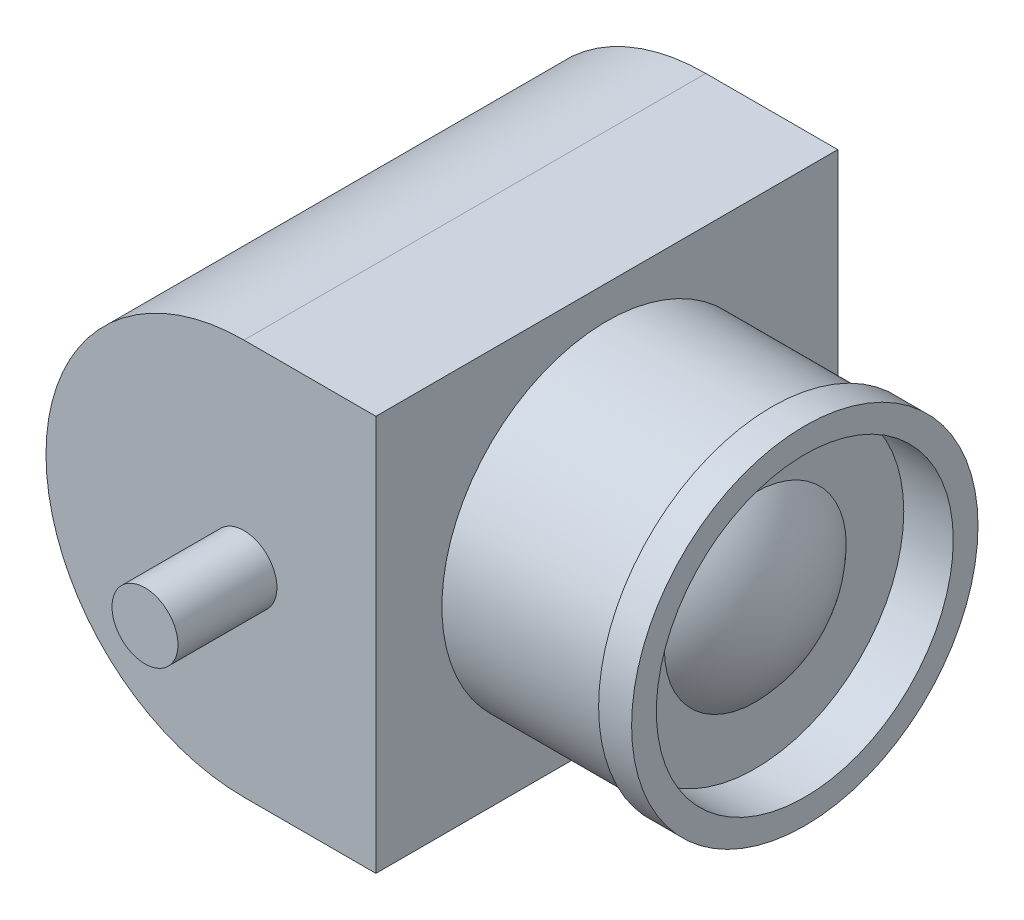
ISO-10303-21;
HEADER;
FILE_DESCRIPTION(('STEP AP214'),'2;1');
FILE_NAME('part.step','',(''),(''),'','','');
FILE_SCHEMA(('AUTOMOTIVE_DESIGN { 1 0 10303 214 1 1 1 1 }'));
ENDSEC;
DATA;
#1=APPLICATION_CONTEXT('core data for automotive mechanical design processes');
#2=APPLICATION_PROTOCOL_DEFINITION('international standard','automotive_design',2000,#1);
#3=PRODUCT_CONTEXT('',#1,'mechanical');
#4=PRODUCT('Part','Part','',(#3));
#5=PRODUCT_RELATED_PRODUCT_CATEGORY('part','',(#4));
#6=PRODUCT_DEFINITION_FORMATION('','',#4);
#7=PRODUCT_DEFINITION_CONTEXT('part definition',#1,'design');
#8=PRODUCT_DEFINITION('design','',#6,#7);
#9=PRODUCT_DEFINITION_SHAPE('','',#8);
#10=(LENGTH_UNIT() NAMED_UNIT(*) SI_UNIT(.MILLI.,.METRE.));
#11=(NAMED_UNIT(*) PLANE_ANGLE_UNIT() SI_UNIT($,.RADIAN.));
#12=(NAMED_UNIT(*) SI_UNIT($,.STERADIAN.) SOLID_ANGLE_UNIT());
#13=UNCERTAINTY_MEASURE_WITH_UNIT(LENGTH_MEASURE(1.E-05),#10,'distance_accuracy_value','');
#14=(GEOMETRIC_REPRESENTATION_CONTEXT(3) GLOBAL_UNCERTAINTY_ASSIGNED_CONTEXT((#13)) GLOBAL_UNIT_ASSIGNED_CONTEXT((#10,
#11,#12)) REPRESENTATION_CONTEXT('',''));
#15=CARTESIAN_POINT('',(0.,0.,0.));
#16=DIRECTION('',(0.,0.,1.));
#17=DIRECTION('',(1.,0.,0.));
#18=AXIS2_PLACEMENT_3D('',#15,#16,#17);
#19=CARTESIAN_POINT('',(10.,6.,-7.));
#20=DIRECTION('',(0.,0.,1.));
#21=DIRECTION('',(0.,-1.,0.));
#22=AXIS2_PLACEMENT_3D('',#19,#20,#21);
#23=PLANE('',#22);
#24=CARTESIAN_POINT('',(6.,0.,-7.));
#25=DIRECTION('',(0.,0.,1.));
#26=DIRECTION('',(0.,-1.,0.));
#27=AXIS2_PLACEMENT_3D('',#24,#25,#26);
#28=CIRCLE('',#27,1.);
#29=CARTESIAN_POINT('',(6.,-1.,-7.));
#30=VERTEX_POINT('',#29);
#31=EDGE_CURVE('E11',#30,#30,#28,.F.);
#32=ORIENTED_EDGE('',*,*,#31,.F.);
#33=EDGE_LOOP('',(#32));
#34=FACE_BOUND('',#33,.T.);
#35=DIRECTION('',(-1.,0.,0.));
#36=VECTOR('',#35,1.);
#37=CARTESIAN_POINT('',(10.,-6.,-7.));
#38=LINE('',#37,#36);
#39=CARTESIAN_POINT('',(10.,-6.,-7.));
#40=VERTEX_POINT('',#39);
#41=CARTESIAN_POINT('',(6.,-6.,-7.));
#42=VERTEX_POINT('',#41);
#43=EDGE_CURVE('E162',#40,#42,#38,.T.);
#44=ORIENTED_EDGE('',*,*,#43,.T.);
#45=CARTESIAN_POINT('',(6.,0.,-7.));
#46=DIRECTION('',(0.,0.,1.));
#47=DIRECTION('',(0.,-1.,0.));
#48=AXIS2_PLACEMENT_3D('',#45,#46,#47);
#49=CIRCLE('',#48,6.);
#50=CARTESIAN_POINT('',(0.,0.,-7.));
#51=VERTEX_POINT('',#50);
#52=EDGE_CURVE('E133',#42,#51,#49,.F.);
#53=ORIENTED_EDGE('',*,*,#52,.T.);
#54=CARTESIAN_POINT('',(6.,0.,-7.));
#55=DIRECTION('',(0.,0.,1.));
#56=DIRECTION('',(0.,-1.,0.));
#57=AXIS2_PLACEMENT_3D('',#54,#55,#56);
#58=CIRCLE('',#57,6.);
#59=CARTESIAN_POINT('',(6.,6.,-7.));
#60=VERTEX_POINT('',#59);
#61=EDGE_CURVE('E114',#51,#60,#58,.F.);
#62=ORIENTED_EDGE('',*,*,#61,.T.);
#63=DIRECTION('',(-1.,0.,0.));
#64=VECTOR('',#63,1.);
#65=CARTESIAN_POINT('',(10.,6.,-7.));
#66=LINE('',#65,#64);
#67=CARTESIAN_POINT('',(10.,6.,-7.));
#68=VERTEX_POINT('',#67);
#69=EDGE_CURVE('E96',#68,#60,#66,.T.);
#70=ORIENTED_EDGE('',*,*,#69,.F.);
#71=DIRECTION('',(0.,1.,0.));
#72=VECTOR('',#71,1.);
#73=CARTESIAN_POINT('',(10.,6.,-7.));
#74=LINE('',#73,#72);
#75=EDGE_CURVE('E101',#40,#68,#74,.T.);
#76=ORIENTED_EDGE('',*,*,#75,.F.);
#77=EDGE_LOOP('',(#44,#53,#62,#70,#76));
#78=FACE_BOUND('',#77,.T.);
#79=ADVANCED_FACE('F44',(#34,#78),#23,.F.);
#80=CARTESIAN_POINT('',(10.,6.,7.));
#81=DIRECTION('',(0.,-1.,0.));
#82=DIRECTION('',(0.,0.,-1.));
#83=AXIS2_PLACEMENT_3D('',#80,#81,#82);
#84=PLANE('',#83);
#85=ORIENTED_EDGE('',*,*,#69,.T.);
#86=DIRECTION('',(0.,0.,1.));
#87=VECTOR('',#86,1.);
#88=CARTESIAN_POINT('',(6.,6.,7.));
#89=LINE('',#88,#87);
#90=CARTESIAN_POINT('',(6.,6.,7.));
#91=VERTEX_POINT('',#90);
#92=EDGE_CURVE('E63',#60,#91,#89,.T.);
#93=ORIENTED_EDGE('',*,*,#92,.T.);
#94=DIRECTION('',(-1.,0.,0.));
#95=VECTOR('',#94,1.);
#96=CARTESIAN_POINT('',(10.,6.,7.));
#97=LINE('',#96,#95);
#98=CARTESIAN_POINT('',(10.,6.,7.));
#99=VERTEX_POINT('',#98);
#100=EDGE_CURVE('E100',#99,#91,#97,.T.);
#101=ORIENTED_EDGE('',*,*,#100,.F.);
#102=DIRECTION('',(0.,0.,1.));
#103=VECTOR('',#102,1.);
#104=CARTESIAN_POINT('',(10.,6.,7.));
#105=LINE('',#104,#103);
#106=EDGE_CURVE('E95',#68,#99,#105,.T.);
#107=ORIENTED_EDGE('',*,*,#106,.F.);
#108=EDGE_LOOP('',(#85,#93,#101,#107));
#109=FACE_BOUND('',#108,.T.);
#110=ADVANCED_FACE('F94',(#109),#84,.F.);
#111=CARTESIAN_POINT('',(10.,6.,7.));
#112=DIRECTION('',(0.,0.,-1.));
#113=DIRECTION('',(0.,1.,0.));
#114=AXIS2_PLACEMENT_3D('',#111,#112,#113);
#115=PLANE('',#114);
#116=CARTESIAN_POINT('',(6.,0.,7.));
#117=DIRECTION('',(0.,0.,-1.));
#118=DIRECTION('',(0.,1.,0.));
#119=AXIS2_PLACEMENT_3D('',#116,#117,#118);
#120=CIRCLE('',#119,1.);
#121=CARTESIAN_POINT('',(6.,0.999999999999998,7.));
#122=VERTEX_POINT('',#121);
#123=EDGE_CURVE('E47',#122,#122,#120,.F.);
#124=ORIENTED_EDGE('',*,*,#123,.F.);
#125=EDGE_LOOP('',(#124));
#126=FACE_BOUND('',#125,.T.);
#127=CARTESIAN_POINT('',(6.,0.,7.));
#128=DIRECTION('',(0.,0.,-1.));
#129=DIRECTION('',(0.,1.,0.));
#130=AXIS2_PLACEMENT_3D('',#127,#128,#129);
#131=CIRCLE('',#130,6.);
#132=CARTESIAN_POINT('',(0.,0.,7.));
#133=VERTEX_POINT('',#132);
#134=EDGE_CURVE('E68',#91,#133,#131,.F.);
#135=ORIENTED_EDGE('',*,*,#134,.T.);
#136=CARTESIAN_POINT('',(6.,0.,7.));
#137=DIRECTION('',(0.,0.,-1.));
#138=DIRECTION('',(0.,1.,0.));
#139=AXIS2_PLACEMENT_3D('',#136,#137,#138);
#140=CIRCLE('',#139,6.);
#141=CARTESIAN_POINT('',(6.,-6.,7.));
#142=VERTEX_POINT('',#141);
#143=EDGE_CURVE('E134',#133,#142,#140,.F.);
#144=ORIENTED_EDGE('',*,*,#143,.T.);
#145=DIRECTION('',(-1.,0.,0.));
#146=VECTOR('',#145,1.);
#147=CARTESIAN_POINT('',(10.,-6.,7.));
#148=LINE('',#147,#146);
#149=CARTESIAN_POINT('',(10.,-6.,7.));
#150=VERTEX_POINT('',#149);
#151=EDGE_CURVE('E119',#150,#142,#148,.T.);
#152=ORIENTED_EDGE('',*,*,#151,.F.);
#153=DIRECTION('',(0.,-1.,0.));
#154=VECTOR('',#153,1.);
#155=CARTESIAN_POINT('',(10.,6.,7.));
#156=LINE('',#155,#154);
#157=EDGE_CURVE('E99',#99,#150,#156,.T.);
#158=ORIENTED_EDGE('',*,*,#157,.F.);
#159=ORIENTED_EDGE('',*,*,#100,.T.);
#160=EDGE_LOOP('',(#135,#144,#152,#158,#159));
#161=FACE_BOUND('',#160,.T.);
#162=ADVANCED_FACE('F189',(#126,#161),#115,.F.);
#163=CARTESIAN_POINT('',(10.,-6.,7.));
#164=DIRECTION('',(0.,1.,0.));
#165=DIRECTION('',(0.,0.,1.));
#166=AXIS2_PLACEMENT_3D('',#163,#164,#165);
#167=PLANE('',#166);
#168=ORIENTED_EDGE('',*,*,#151,.T.);
#169=DIRECTION('',(0.,0.,-1.));
#170=VECTOR('',#169,1.);
#171=CARTESIAN_POINT('',(6.,-6.,7.));
#172=LINE('',#171,#170);
#173=EDGE_CURVE('E120',#142,#42,#172,.T.);
#174=ORIENTED_EDGE('',*,*,#173,.T.);
#175=ORIENTED_EDGE('',*,*,#43,.F.);
#176=DIRECTION('',(0.,0.,-1.));
#177=VECTOR('',#176,1.);
#178=CARTESIAN_POINT('',(10.,-6.,7.));
#179=LINE('',#178,#177);
#180=EDGE_CURVE('E106',#150,#40,#179,.T.);
#181=ORIENTED_EDGE('',*,*,#180,.F.);
#182=EDGE_LOOP('',(#168,#174,#175,#181));
#183=FACE_BOUND('',#182,.T.);
#184=ADVANCED_FACE('F169',(#183),#167,.F.);
#185=CARTESIAN_POINT('',(10.,0.,0.));
#186=DIRECTION('',(1.,0.,0.));
#187=DIRECTION('',(0.,0.,-1.));
#188=AXIS2_PLACEMENT_3D('',#185,#186,#187);
#189=PLANE('',#188);
#190=CARTESIAN_POINT('',(10.,0.,0.));
#191=DIRECTION('',(1.,0.,0.));
#192=DIRECTION('',(0.,0.,-1.));
#193=AXIS2_PLACEMENT_3D('',#190,#191,#192);
#194=CIRCLE('',#193,5.);
#195=CARTESIAN_POINT('',(10.,0.,-5.));
#196=VERTEX_POINT('',#195);
#197=EDGE_CURVE('E111',#196,#196,#194,.T.);
#198=ORIENTED_EDGE('',*,*,#197,.F.);
#199=EDGE_LOOP('',(#198));
#200=FACE_BOUND('',#199,.T.);
#201=ORIENTED_EDGE('',*,*,#75,.T.);
#202=ORIENTED_EDGE('',*,*,#106,.T.);
#203=ORIENTED_EDGE('',*,*,#157,.T.);
#204=ORIENTED_EDGE('',*,*,#180,.T.);
#205=EDGE_LOOP('',(#201,#202,#203,#204));
#206=FACE_BOUND('',#205,.T.);
#207=ADVANCED_FACE('F102',(#200,#206),#189,.T.);
#208=CARTESIAN_POINT('',(15.,0.,0.));
#209=DIRECTION('',(-1.,0.,0.));
#210=DIRECTION('',(0.,0.,1.));
#211=AXIS2_PLACEMENT_3D('',#208,#209,#210);
#212=CYLINDRICAL_SURFACE('',#211,5.);
#213=CARTESIAN_POINT('',(15.,0.,0.));
#214=DIRECTION('',(1.,0.,0.));
#215=DIRECTION('',(0.,0.,-1.));
#216=AXIS2_PLACEMENT_3D('',#213,#214,#215);
#217=CIRCLE('',#216,5.);
#218=CARTESIAN_POINT('',(15.,0.,-5.));
#219=VERTEX_POINT('',#218);
#220=EDGE_CURVE('E109',#219,#219,#217,.T.);
#221=ORIENTED_EDGE('',*,*,#220,.F.);
#222=EDGE_LOOP('',(#221));
#223=FACE_BOUND('',#222,.T.);
#224=ORIENTED_EDGE('',*,*,#197,.T.);
#225=EDGE_LOOP('',(#224));
#226=FACE_BOUND('',#225,.T.);
#227=ADVANCED_FACE('F196',(#223,#226),#212,.T.);
#228=CARTESIAN_POINT('',(16.,0.,0.));
#229=DIRECTION('',(-1.,0.,0.));
#230=DIRECTION('',(0.,0.,1.));
#231=AXIS2_PLACEMENT_3D('',#228,#229,#230);
#232=CYLINDRICAL_SURFACE('',#231,5.25);
#233=CARTESIAN_POINT('',(16.,0.,0.));
#234=DIRECTION('',(1.,0.,0.));
#235=DIRECTION('',(0.,0.,-1.));
#236=AXIS2_PLACEMENT_3D('',#233,#234,#235);
#237=CIRCLE('',#236,5.25);
#238=CARTESIAN_POINT('',(16.,0.,-5.25));
#239=VERTEX_POINT('',#238);
#240=EDGE_CURVE('E152',#239,#239,#237,.T.);
#241=ORIENTED_EDGE('',*,*,#240,.F.);
#242=EDGE_LOOP('',(#241));
#243=FACE_BOUND('',#242,.T.);
#244=CARTESIAN_POINT('',(15.,0.,0.));
#245=DIRECTION('',(1.,0.,0.));
#246=DIRECTION('',(0.,0.,-1.));
#247=AXIS2_PLACEMENT_3D('',#244,#245,#246);
#248=CIRCLE('',#247,5.25);
#249=CARTESIAN_POINT('',(15.,0.,-5.25));
#250=VERTEX_POINT('',#249);
#251=EDGE_CURVE('E151',#250,#250,#248,.T.);
#252=ORIENTED_EDGE('',*,*,#251,.T.);
#253=EDGE_LOOP('',(#252));
#254=FACE_BOUND('',#253,.T.);
#255=ADVANCED_FACE('F205',(#243,#254),#232,.T.);
#256=CARTESIAN_POINT('',(16.,0.,0.));
#257=DIRECTION('',(1.,0.,0.));
#258=DIRECTION('',(0.,0.,-1.));
#259=AXIS2_PLACEMENT_3D('',#256,#257,#258);
#260=PLANE('',#259);
#261=CARTESIAN_POINT('',(16.,0.,0.));
#262=DIRECTION('',(1.,0.,0.));
#263=DIRECTION('',(0.,0.,-1.));
#264=AXIS2_PLACEMENT_3D('',#261,#262,#263);
#265=CIRCLE('',#264,4.5);
#266=CARTESIAN_POINT('',(16.,0.,-4.5));
#267=VERTEX_POINT('',#266);
#268=EDGE_CURVE('E127',#267,#267,#265,.T.);
#269=ORIENTED_EDGE('',*,*,#268,.F.);
#270=EDGE_LOOP('',(#269));
#271=FACE_BOUND('',#270,.T.);
#272=ORIENTED_EDGE('',*,*,#240,.T.);
#273=EDGE_LOOP('',(#272));
#274=FACE_BOUND('',#273,.T.);
#275=ADVANCED_FACE('F206',(#271,#274),#260,.T.);
#276=CARTESIAN_POINT('',(15.,0.,0.));
#277=DIRECTION('',(1.,0.,0.));
#278=DIRECTION('',(0.,0.,-1.));
#279=AXIS2_PLACEMENT_3D('',#276,#277,#278);
#280=PLANE('',#279);
#281=ORIENTED_EDGE('',*,*,#220,.T.);
#282=EDGE_LOOP('',(#281));
#283=FACE_BOUND('',#282,.T.);
#284=ORIENTED_EDGE('',*,*,#251,.F.);
#285=EDGE_LOOP('',(#284));
#286=FACE_BOUND('',#285,.T.);
#287=ADVANCED_FACE('F208',(#283,#286),#280,.F.);
#288=CARTESIAN_POINT('',(14.5,0.,0.));
#289=DIRECTION('',(1.,0.,0.));
#290=DIRECTION('',(0.,0.,-1.));
#291=AXIS2_PLACEMENT_3D('',#288,#289,#290);
#292=CYLINDRICAL_SURFACE('',#291,4.5);
#293=CARTESIAN_POINT('',(14.5,0.,0.));
#294=DIRECTION('',(1.,0.,0.));
#295=DIRECTION('',(0.,0.,-1.));
#296=AXIS2_PLACEMENT_3D('',#293,#294,#295);
#297=CIRCLE('',#296,4.5);
#298=CARTESIAN_POINT('',(14.5,0.,-4.5));
#299=VERTEX_POINT('',#298);
#300=EDGE_CURVE('E146',#299,#299,#297,.T.);
#301=ORIENTED_EDGE('',*,*,#300,.F.);
#302=EDGE_LOOP('',(#301));
#303=FACE_BOUND('',#302,.T.);
#304=ORIENTED_EDGE('',*,*,#268,.T.);
#305=EDGE_LOOP('',(#304));
#306=FACE_BOUND('',#305,.T.);
#307=ADVANCED_FACE('F211',(#303,#306),#292,.F.);
#308=CARTESIAN_POINT('',(14.5,0.,0.));
#309=DIRECTION('',(1.,0.,0.));
#310=DIRECTION('',(0.,0.,-1.));
#311=AXIS2_PLACEMENT_3D('',#308,#309,#310);
#312=PLANE('',#311);
#313=CARTESIAN_POINT('',(14.5,0.,0.));
#314=DIRECTION('',(1.,0.,0.));
#315=DIRECTION('',(0.,0.,-1.));
#316=AXIS2_PLACEMENT_3D('',#313,#314,#315);
#317=CIRCLE('',#316,2.75499546279118);
#318=CARTESIAN_POINT('',(14.5,0.,-2.75499546279118));
#319=VERTEX_POINT('',#318);
#320=EDGE_CURVE('E123',#319,#319,#317,.F.);
#321=ORIENTED_EDGE('',*,*,#320,.T.);
#322=EDGE_LOOP('',(#321));
#323=FACE_BOUND('',#322,.T.);
#324=ORIENTED_EDGE('',*,*,#300,.T.);
#325=EDGE_LOOP('',(#324));
#326=FACE_BOUND('',#325,.T.);
#327=ADVANCED_FACE('F179',(#323,#326),#312,.T.);
#328=CARTESIAN_POINT('',(11.6,0.,0.));
#329=DIRECTION('',(-1.,0.,0.));
#330=DIRECTION('',(0.,0.,1.));
#331=AXIS2_PLACEMENT_3D('',#328,#329,#330);
#332=SPHERICAL_SURFACE('',#331,4.);
#333=ORIENTED_EDGE('',*,*,#320,.F.);
#334=EDGE_LOOP('',(#333));
#335=FACE_BOUND('',#334,.T.);
#336=ADVANCED_FACE('F175',(#335),#332,.T.);
#337=CARTESIAN_POINT('',(6.,0.,7.));
#338=DIRECTION('',(0.,0.,1.));
#339=DIRECTION('',(1.,0.,0.));
#340=AXIS2_PLACEMENT_3D('',#337,#338,#339);
#341=CYLINDRICAL_SURFACE('',#340,6.);
#342=DIRECTION('',(0.,0.,1.));
#343=VECTOR('',#342,1.);
#344=CARTESIAN_POINT('',(0.,0.,0.));
#345=LINE('',#344,#343);
#346=EDGE_CURVE('E130',#133,#51,#345,.F.);
#347=ORIENTED_EDGE('',*,*,#346,.F.);
#348=ORIENTED_EDGE('',*,*,#134,.F.);
#349=ORIENTED_EDGE('',*,*,#92,.F.);
#350=ORIENTED_EDGE('',*,*,#61,.F.);
#351=EDGE_LOOP('',(#347,#348,#349,#350));
#352=FACE_BOUND('',#351,.T.);
#353=ADVANCED_FACE('F50',(#352),#341,.T.);
#354=CARTESIAN_POINT('',(6.,0.,7.));
#355=DIRECTION('',(0.,0.,-1.));
#356=DIRECTION('',(-1.,0.,0.));
#357=AXIS2_PLACEMENT_3D('',#354,#355,#356);
#358=CYLINDRICAL_SURFACE('',#357,6.);
#359=ORIENTED_EDGE('',*,*,#143,.F.);
#360=ORIENTED_EDGE('',*,*,#346,.T.);
#361=ORIENTED_EDGE('',*,*,#52,.F.);
#362=ORIENTED_EDGE('',*,*,#173,.F.);
#363=EDGE_LOOP('',(#359,#360,#361,#362));
#364=FACE_BOUND('',#363,.T.);
#365=ADVANCED_FACE('F166',(#364),#358,.T.);
#366=CARTESIAN_POINT('',(6.,0.,10.));
#367=DIRECTION('',(0.,0.,1.));
#368=DIRECTION('',(1.,0.,0.));
#369=AXIS2_PLACEMENT_3D('',#366,#367,#368);
#370=PLANE('',#369);
#371=CARTESIAN_POINT('',(6.,0.,10.));
#372=DIRECTION('',(0.,0.,1.));
#373=DIRECTION('',(1.,0.,0.));
#374=AXIS2_PLACEMENT_3D('',#371,#372,#373);
#375=CIRCLE('',#374,1.);
#376=CARTESIAN_POINT('',(7.,0.,10.));
#377=VERTEX_POINT('',#376);
#378=EDGE_CURVE('E140',#377,#377,#375,.T.);
#379=ORIENTED_EDGE('',*,*,#378,.T.);
#380=EDGE_LOOP('',(#379));
#381=FACE_BOUND('',#380,.T.);
#382=ADVANCED_FACE('F180',(#381),#370,.T.);
#383=CARTESIAN_POINT('',(6.,0.,10.));
#384=DIRECTION('',(0.,0.,-1.));
#385=DIRECTION('',(-1.,0.,0.));
#386=AXIS2_PLACEMENT_3D('',#383,#384,#385);
#387=CYLINDRICAL_SURFACE('',#386,1.);
#388=ORIENTED_EDGE('',*,*,#378,.F.);
#389=EDGE_LOOP('',(#388));
#390=FACE_BOUND('',#389,.T.);
#391=ORIENTED_EDGE('',*,*,#123,.T.);
#392=EDGE_LOOP('',(#391));
#393=FACE_BOUND('',#392,.T.);
#394=ADVANCED_FACE('F228',(#390,#393),#387,.T.);
#395=CARTESIAN_POINT('',(6.,0.,-10.));
#396=DIRECTION('',(0.,0.,1.));
#397=DIRECTION('',(1.,0.,0.));
#398=AXIS2_PLACEMENT_3D('',#395,#396,#397);
#399=CIRCLE('',#398,1.);
#400=CARTESIAN_POINT('',(7.,0.,-10.));
#401=VERTEX_POINT('',#400);
#402=EDGE_CURVE('E143',#401,#401,#399,.T.);
#403=ORIENTED_EDGE('',*,*,#402,.T.);
#404=EDGE_LOOP('',(#403));
#405=FACE_BOUND('',#404,.T.);
#406=ORIENTED_EDGE('',*,*,#31,.T.);
#407=EDGE_LOOP('',(#406));
#408=FACE_BOUND('',#407,.T.);
#409=ADVANCED_FACE('F225',(#405,#408),#387,.T.);
#410=CARTESIAN_POINT('',(6.,0.,-10.));
#411=DIRECTION('',(0.,0.,1.));
#412=DIRECTION('',(1.,0.,0.));
#413=AXIS2_PLACEMENT_3D('',#410,#411,#412);
#414=PLANE('',#413);
#415=ORIENTED_EDGE('',*,*,#402,.F.);
#416=EDGE_LOOP('',(#415));
#417=FACE_BOUND('',#416,.T.);
#418=ADVANCED_FACE('F223',(#417),#414,.F.);
#419=CLOSED_SHELL('',(#79,#110,#162,#184,#207,#227,#255,#275,#287,#307,#327,#336,#353,#365,#382,
#394,#409,#418));
#420=MANIFOLD_SOLID_BREP('B2',#419);
#421=ADVANCED_BREP_SHAPE_REPRESENTATION('',(#18,#420),#14);
#422=SHAPE_DEFINITION_REPRESENTATION(#9,#421);
ENDSEC;
END-ISO-10303-21;
